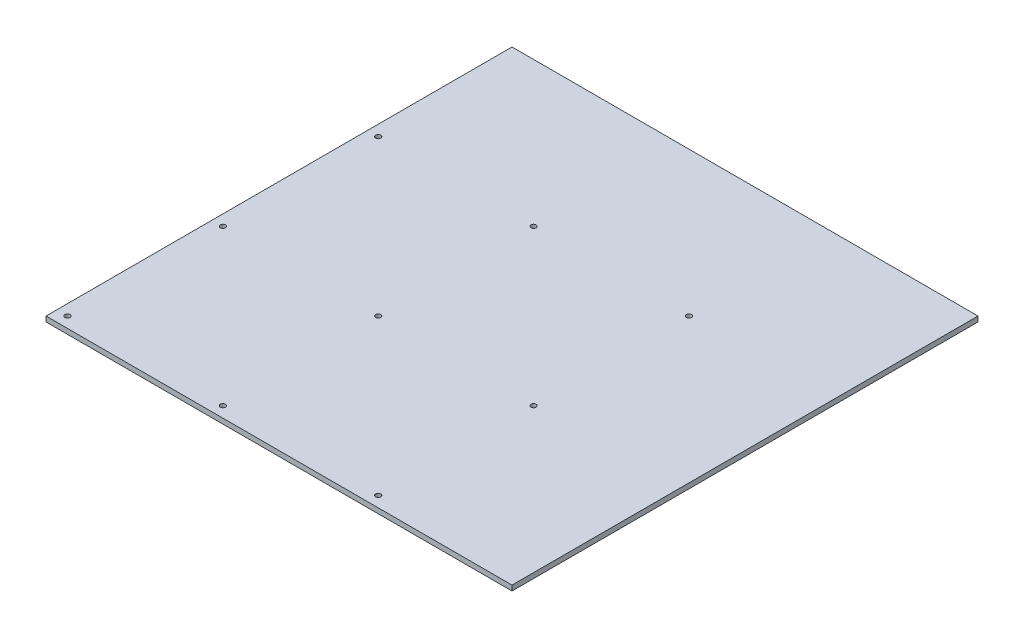
ISO-10303-21;
HEADER;
FILE_DESCRIPTION(('STEP AP214'),'2;1');
FILE_NAME('part.step','',(''),(''),'','','');
FILE_SCHEMA(('AUTOMOTIVE_DESIGN { 1 0 10303 214 1 1 1 1 }'));
ENDSEC;
DATA;
#1=APPLICATION_CONTEXT('core data for automotive mechanical design processes');
#2=APPLICATION_PROTOCOL_DEFINITION('international standard','automotive_design',2000,#1);
#3=PRODUCT_CONTEXT('',#1,'mechanical');
#4=PRODUCT('Part','Part','',(#3));
#5=PRODUCT_RELATED_PRODUCT_CATEGORY('part','',(#4));
#6=PRODUCT_DEFINITION_FORMATION('','',#4);
#7=PRODUCT_DEFINITION_CONTEXT('part definition',#1,'design');
#8=PRODUCT_DEFINITION('design','',#6,#7);
#9=PRODUCT_DEFINITION_SHAPE('','',#8);
#10=(LENGTH_UNIT() NAMED_UNIT(*) SI_UNIT(.MILLI.,.METRE.));
#11=(NAMED_UNIT(*) PLANE_ANGLE_UNIT() SI_UNIT($,.RADIAN.));
#12=(NAMED_UNIT(*) SI_UNIT($,.STERADIAN.) SOLID_ANGLE_UNIT());
#13=UNCERTAINTY_MEASURE_WITH_UNIT(LENGTH_MEASURE(1.E-05),#10,'distance_accuracy_value','');
#14=(GEOMETRIC_REPRESENTATION_CONTEXT(3) GLOBAL_UNCERTAINTY_ASSIGNED_CONTEXT((#13)) GLOBAL_UNIT_ASSIGNED_CONTEXT((#10,
#11,#12)) REPRESENTATION_CONTEXT('',''));
#15=CARTESIAN_POINT('',(0.,0.,0.));
#16=DIRECTION('',(0.,0.,1.));
#17=DIRECTION('',(1.,0.,0.));
#18=AXIS2_PLACEMENT_3D('',#15,#16,#17);
#19=CARTESIAN_POINT('',(0.,6.,0.));
#20=DIRECTION('',(0.,1.,0.));
#21=DIRECTION('',(0.,0.,1.));
#22=AXIS2_PLACEMENT_3D('',#19,#20,#21);
#23=PLANE('',#22);
#24=CARTESIAN_POINT('',(-257.500000000001,6.,77.5000000000001));
#25=DIRECTION('',(0.,1.,0.));
#26=DIRECTION('',(0.,0.,1.));
#27=AXIS2_PLACEMENT_3D('',#24,#25,#26);
#28=CIRCLE('',#27,2.99999999999999);
#29=CARTESIAN_POINT('',(-257.500000000001,6.,80.5000000000001));
#30=VERTEX_POINT('',#29);
#31=EDGE_CURVE('E152',#30,#30,#28,.T.);
#32=ORIENTED_EDGE('',*,*,#31,.F.);
#33=EDGE_LOOP('',(#32));
#34=FACE_BOUND('',#33,.T.);
#35=CARTESIAN_POINT('',(-77.5000000000012,6.,-102.5));
#36=DIRECTION('',(0.,1.,0.));
#37=DIRECTION('',(0.,0.,1.));
#38=AXIS2_PLACEMENT_3D('',#35,#36,#37);
#39=CIRCLE('',#38,3.00000000000001);
#40=CARTESIAN_POINT('',(-77.5000000000012,6.,-99.4999999999999));
#41=VERTEX_POINT('',#40);
#42=EDGE_CURVE('E140',#41,#41,#39,.T.);
#43=ORIENTED_EDGE('',*,*,#42,.F.);
#44=EDGE_LOOP('',(#43));
#45=FACE_BOUND('',#44,.T.);
#46=CARTESIAN_POINT('',(-77.5000000000006,6.,77.5000000000001));
#47=DIRECTION('',(0.,1.,0.));
#48=DIRECTION('',(0.,0.,1.));
#49=AXIS2_PLACEMENT_3D('',#46,#47,#48);
#50=CIRCLE('',#49,3.00000000000001);
#51=CARTESIAN_POINT('',(-77.5000000000006,6.,80.5000000000001));
#52=VERTEX_POINT('',#51);
#53=EDGE_CURVE('E128',#52,#52,#50,.T.);
#54=ORIENTED_EDGE('',*,*,#53,.F.);
#55=EDGE_LOOP('',(#54));
#56=FACE_BOUND('',#55,.T.);
#57=CARTESIAN_POINT('',(-77.5,6.,257.5));
#58=DIRECTION('',(0.,1.,0.));
#59=DIRECTION('',(0.,0.,1.));
#60=AXIS2_PLACEMENT_3D('',#57,#58,#59);
#61=CIRCLE('',#60,3.00000000000001);
#62=CARTESIAN_POINT('',(-77.5,6.,260.5));
#63=VERTEX_POINT('',#62);
#64=EDGE_CURVE('E116',#63,#63,#61,.T.);
#65=ORIENTED_EDGE('',*,*,#64,.F.);
#66=EDGE_LOOP('',(#65));
#67=FACE_BOUND('',#66,.T.);
#68=DIRECTION('',(0.,0.,1.));
#69=VECTOR('',#68,1.);
#70=CARTESIAN_POINT('',(-270.,6.,270.));
#71=LINE('',#70,#69);
#72=CARTESIAN_POINT('',(-270.,6.,-270.));
#73=VERTEX_POINT('',#72);
#74=CARTESIAN_POINT('',(-270.,6.,270.));
#75=VERTEX_POINT('',#74);
#76=EDGE_CURVE('E86',#73,#75,#71,.T.);
#77=ORIENTED_EDGE('',*,*,#76,.T.);
#78=DIRECTION('',(1.,0.,0.));
#79=VECTOR('',#78,1.);
#80=CARTESIAN_POINT('',(270.,6.,270.));
#81=LINE('',#80,#79);
#82=CARTESIAN_POINT('',(270.,6.,270.));
#83=VERTEX_POINT('',#82);
#84=EDGE_CURVE('E81',#75,#83,#81,.T.);
#85=ORIENTED_EDGE('',*,*,#84,.T.);
#86=DIRECTION('',(0.,0.,-1.));
#87=VECTOR('',#86,1.);
#88=CARTESIAN_POINT('',(270.,6.,270.));
#89=LINE('',#88,#87);
#90=CARTESIAN_POINT('',(270.,6.,-270.));
#91=VERTEX_POINT('',#90);
#92=EDGE_CURVE('E84',#83,#91,#89,.T.);
#93=ORIENTED_EDGE('',*,*,#92,.T.);
#94=DIRECTION('',(-1.,0.,0.));
#95=VECTOR('',#94,1.);
#96=CARTESIAN_POINT('',(270.,6.,-270.));
#97=LINE('',#96,#95);
#98=EDGE_CURVE('E51',#91,#73,#97,.T.);
#99=ORIENTED_EDGE('',*,*,#98,.T.);
#100=EDGE_LOOP('',(#77,#85,#93,#99));
#101=FACE_BOUND('',#100,.T.);
#102=CARTESIAN_POINT('',(-257.5,6.,257.5));
#103=DIRECTION('',(0.,1.,0.));
#104=DIRECTION('',(0.,0.,1.));
#105=AXIS2_PLACEMENT_3D('',#102,#103,#104);
#106=CIRCLE('',#105,2.99999999999999);
#107=CARTESIAN_POINT('',(-257.5,6.,260.5));
#108=VERTEX_POINT('',#107);
#109=EDGE_CURVE('E101',#108,#108,#106,.T.);
#110=ORIENTED_EDGE('',*,*,#109,.F.);
#111=EDGE_LOOP('',(#110));
#112=FACE_BOUND('',#111,.T.);
#113=CARTESIAN_POINT('',(102.5,6.,257.5));
#114=DIRECTION('',(0.,1.,0.));
#115=DIRECTION('',(0.,0.,1.));
#116=AXIS2_PLACEMENT_3D('',#113,#114,#115);
#117=CIRCLE('',#116,3.00000000000001);
#118=CARTESIAN_POINT('',(102.5,6.,260.5));
#119=VERTEX_POINT('',#118);
#120=EDGE_CURVE('E122',#119,#119,#117,.T.);
#121=ORIENTED_EDGE('',*,*,#120,.F.);
#122=EDGE_LOOP('',(#121));
#123=FACE_BOUND('',#122,.T.);
#124=CARTESIAN_POINT('',(102.499999999999,6.,77.5000000000001));
#125=DIRECTION('',(0.,1.,0.));
#126=DIRECTION('',(0.,0.,1.));
#127=AXIS2_PLACEMENT_3D('',#124,#125,#126);
#128=CIRCLE('',#127,3.00000000000001);
#129=CARTESIAN_POINT('',(102.499999999999,6.,80.5000000000001));
#130=VERTEX_POINT('',#129);
#131=EDGE_CURVE('E134',#130,#130,#128,.T.);
#132=ORIENTED_EDGE('',*,*,#131,.F.);
#133=EDGE_LOOP('',(#132));
#134=FACE_BOUND('',#133,.T.);
#135=CARTESIAN_POINT('',(102.499999999999,6.,-102.5));
#136=DIRECTION('',(0.,1.,0.));
#137=DIRECTION('',(0.,0.,1.));
#138=AXIS2_PLACEMENT_3D('',#135,#136,#137);
#139=CIRCLE('',#138,3.00000000000001);
#140=CARTESIAN_POINT('',(102.499999999999,6.,-99.4999999999999));
#141=VERTEX_POINT('',#140);
#142=EDGE_CURVE('E146',#141,#141,#139,.T.);
#143=ORIENTED_EDGE('',*,*,#142,.F.);
#144=EDGE_LOOP('',(#143));
#145=FACE_BOUND('',#144,.T.);
#146=CARTESIAN_POINT('',(-257.500000000001,6.,-102.5));
#147=DIRECTION('',(0.,1.,0.));
#148=DIRECTION('',(0.,0.,1.));
#149=AXIS2_PLACEMENT_3D('',#146,#147,#148);
#150=CIRCLE('',#149,2.99999999999999);
#151=CARTESIAN_POINT('',(-257.500000000001,6.,-99.4999999999999));
#152=VERTEX_POINT('',#151);
#153=EDGE_CURVE('E158',#152,#152,#150,.T.);
#154=ORIENTED_EDGE('',*,*,#153,.F.);
#155=EDGE_LOOP('',(#154));
#156=FACE_BOUND('',#155,.T.);
#157=ADVANCED_FACE('F34',(#34,#45,#56,#67,#101,#112,#123,#134,#145,#156),#23,.T.);
#158=CARTESIAN_POINT('',(0.,0.,0.));
#159=DIRECTION('',(0.,1.,0.));
#160=DIRECTION('',(0.,0.,1.));
#161=AXIS2_PLACEMENT_3D('',#158,#159,#160);
#162=PLANE('',#161);
#163=DIRECTION('',(0.,0.,1.));
#164=VECTOR('',#163,1.);
#165=CARTESIAN_POINT('',(-270.,0.,270.));
#166=LINE('',#165,#164);
#167=CARTESIAN_POINT('',(-270.,0.,-270.));
#168=VERTEX_POINT('',#167);
#169=CARTESIAN_POINT('',(-270.,0.,270.));
#170=VERTEX_POINT('',#169);
#171=EDGE_CURVE('E98',#168,#170,#166,.T.);
#172=ORIENTED_EDGE('',*,*,#171,.F.);
#173=DIRECTION('',(-1.,0.,0.));
#174=VECTOR('',#173,1.);
#175=CARTESIAN_POINT('',(270.,0.,-270.));
#176=LINE('',#175,#174);
#177=CARTESIAN_POINT('',(270.,0.,-270.));
#178=VERTEX_POINT('',#177);
#179=EDGE_CURVE('E74',#178,#168,#176,.T.);
#180=ORIENTED_EDGE('',*,*,#179,.F.);
#181=DIRECTION('',(0.,0.,-1.));
#182=VECTOR('',#181,1.);
#183=CARTESIAN_POINT('',(270.,0.,270.));
#184=LINE('',#183,#182);
#185=CARTESIAN_POINT('',(270.,0.,270.));
#186=VERTEX_POINT('',#185);
#187=EDGE_CURVE('E68',#186,#178,#184,.T.);
#188=ORIENTED_EDGE('',*,*,#187,.F.);
#189=DIRECTION('',(1.,0.,0.));
#190=VECTOR('',#189,1.);
#191=CARTESIAN_POINT('',(270.,0.,270.));
#192=LINE('',#191,#190);
#193=EDGE_CURVE('E90',#170,#186,#192,.T.);
#194=ORIENTED_EDGE('',*,*,#193,.F.);
#195=EDGE_LOOP('',(#172,#180,#188,#194));
#196=FACE_BOUND('',#195,.T.);
#197=CARTESIAN_POINT('',(-257.5,0.,257.5));
#198=DIRECTION('',(0.,1.,0.));
#199=DIRECTION('',(0.,0.,1.));
#200=AXIS2_PLACEMENT_3D('',#197,#198,#199);
#201=CIRCLE('',#200,2.99999999999999);
#202=CARTESIAN_POINT('',(-257.5,0.,260.5));
#203=VERTEX_POINT('',#202);
#204=EDGE_CURVE('E113',#203,#203,#201,.T.);
#205=ORIENTED_EDGE('',*,*,#204,.T.);
#206=EDGE_LOOP('',(#205));
#207=FACE_BOUND('',#206,.T.);
#208=CARTESIAN_POINT('',(-77.5,0.,257.5));
#209=DIRECTION('',(0.,1.,0.));
#210=DIRECTION('',(0.,0.,1.));
#211=AXIS2_PLACEMENT_3D('',#208,#209,#210);
#212=CIRCLE('',#211,3.00000000000001);
#213=CARTESIAN_POINT('',(-77.5,0.,260.5));
#214=VERTEX_POINT('',#213);
#215=EDGE_CURVE('E119',#214,#214,#212,.T.);
#216=ORIENTED_EDGE('',*,*,#215,.T.);
#217=EDGE_LOOP('',(#216));
#218=FACE_BOUND('',#217,.T.);
#219=CARTESIAN_POINT('',(102.5,0.,257.5));
#220=DIRECTION('',(0.,1.,0.));
#221=DIRECTION('',(0.,0.,1.));
#222=AXIS2_PLACEMENT_3D('',#219,#220,#221);
#223=CIRCLE('',#222,3.00000000000001);
#224=CARTESIAN_POINT('',(102.5,0.,260.5));
#225=VERTEX_POINT('',#224);
#226=EDGE_CURVE('E125',#225,#225,#223,.T.);
#227=ORIENTED_EDGE('',*,*,#226,.T.);
#228=EDGE_LOOP('',(#227));
#229=FACE_BOUND('',#228,.T.);
#230=CARTESIAN_POINT('',(-77.5000000000006,0.,77.5000000000001));
#231=DIRECTION('',(0.,1.,0.));
#232=DIRECTION('',(0.,0.,1.));
#233=AXIS2_PLACEMENT_3D('',#230,#231,#232);
#234=CIRCLE('',#233,3.00000000000001);
#235=CARTESIAN_POINT('',(-77.5000000000006,0.,80.5000000000001));
#236=VERTEX_POINT('',#235);
#237=EDGE_CURVE('E131',#236,#236,#234,.T.);
#238=ORIENTED_EDGE('',*,*,#237,.T.);
#239=EDGE_LOOP('',(#238));
#240=FACE_BOUND('',#239,.T.);
#241=CARTESIAN_POINT('',(102.499999999999,0.,77.5000000000001));
#242=DIRECTION('',(0.,1.,0.));
#243=DIRECTION('',(0.,0.,1.));
#244=AXIS2_PLACEMENT_3D('',#241,#242,#243);
#245=CIRCLE('',#244,3.00000000000001);
#246=CARTESIAN_POINT('',(102.499999999999,0.,80.5000000000001));
#247=VERTEX_POINT('',#246);
#248=EDGE_CURVE('E137',#247,#247,#245,.T.);
#249=ORIENTED_EDGE('',*,*,#248,.T.);
#250=EDGE_LOOP('',(#249));
#251=FACE_BOUND('',#250,.T.);
#252=CARTESIAN_POINT('',(-77.5000000000012,0.,-102.5));
#253=DIRECTION('',(0.,1.,0.));
#254=DIRECTION('',(0.,0.,1.));
#255=AXIS2_PLACEMENT_3D('',#252,#253,#254);
#256=CIRCLE('',#255,3.00000000000001);
#257=CARTESIAN_POINT('',(-77.5000000000012,0.,-99.4999999999999));
#258=VERTEX_POINT('',#257);
#259=EDGE_CURVE('E143',#258,#258,#256,.T.);
#260=ORIENTED_EDGE('',*,*,#259,.T.);
#261=EDGE_LOOP('',(#260));
#262=FACE_BOUND('',#261,.T.);
#263=CARTESIAN_POINT('',(102.499999999999,0.,-102.5));
#264=DIRECTION('',(0.,1.,0.));
#265=DIRECTION('',(0.,0.,1.));
#266=AXIS2_PLACEMENT_3D('',#263,#264,#265);
#267=CIRCLE('',#266,3.00000000000001);
#268=CARTESIAN_POINT('',(102.499999999999,0.,-99.4999999999999));
#269=VERTEX_POINT('',#268);
#270=EDGE_CURVE('E149',#269,#269,#267,.T.);
#271=ORIENTED_EDGE('',*,*,#270,.T.);
#272=EDGE_LOOP('',(#271));
#273=FACE_BOUND('',#272,.T.);
#274=CARTESIAN_POINT('',(-257.500000000001,0.,77.5000000000001));
#275=DIRECTION('',(0.,1.,0.));
#276=DIRECTION('',(0.,0.,1.));
#277=AXIS2_PLACEMENT_3D('',#274,#275,#276);
#278=CIRCLE('',#277,2.99999999999999);
#279=CARTESIAN_POINT('',(-257.500000000001,0.,80.5000000000001));
#280=VERTEX_POINT('',#279);
#281=EDGE_CURVE('E155',#280,#280,#278,.T.);
#282=ORIENTED_EDGE('',*,*,#281,.T.);
#283=EDGE_LOOP('',(#282));
#284=FACE_BOUND('',#283,.T.);
#285=CARTESIAN_POINT('',(-257.500000000001,0.,-102.5));
#286=DIRECTION('',(0.,1.,0.));
#287=DIRECTION('',(0.,0.,1.));
#288=AXIS2_PLACEMENT_3D('',#285,#286,#287);
#289=CIRCLE('',#288,2.99999999999999);
#290=CARTESIAN_POINT('',(-257.500000000001,0.,-99.4999999999999));
#291=VERTEX_POINT('',#290);
#292=EDGE_CURVE('E161',#291,#291,#289,.T.);
#293=ORIENTED_EDGE('',*,*,#292,.T.);
#294=EDGE_LOOP('',(#293));
#295=FACE_BOUND('',#294,.T.);
#296=ADVANCED_FACE('F109',(#196,#207,#218,#229,#240,#251,#262,#273,#284,#295),#162,.F.);
#297=CARTESIAN_POINT('',(-270.,6.,270.));
#298=DIRECTION('',(1.,0.,0.));
#299=DIRECTION('',(0.,0.,-1.));
#300=AXIS2_PLACEMENT_3D('',#297,#298,#299);
#301=PLANE('',#300);
#302=ORIENTED_EDGE('',*,*,#171,.T.);
#303=DIRECTION('',(0.,-1.,0.));
#304=VECTOR('',#303,1.);
#305=CARTESIAN_POINT('',(-270.,6.,270.));
#306=LINE('',#305,#304);
#307=EDGE_CURVE('E11',#75,#170,#306,.T.);
#308=ORIENTED_EDGE('',*,*,#307,.F.);
#309=ORIENTED_EDGE('',*,*,#76,.F.);
#310=DIRECTION('',(0.,-1.,0.));
#311=VECTOR('',#310,1.);
#312=CARTESIAN_POINT('',(-270.,6.,-270.));
#313=LINE('',#312,#311);
#314=EDGE_CURVE('E94',#73,#168,#313,.T.);
#315=ORIENTED_EDGE('',*,*,#314,.T.);
#316=EDGE_LOOP('',(#302,#308,#309,#315));
#317=FACE_BOUND('',#316,.T.);
#318=ADVANCED_FACE('F36',(#317),#301,.F.);
#319=CARTESIAN_POINT('',(270.,6.,270.));
#320=DIRECTION('',(0.,0.,-1.));
#321=DIRECTION('',(-1.,0.,0.));
#322=AXIS2_PLACEMENT_3D('',#319,#320,#321);
#323=PLANE('',#322);
#324=ORIENTED_EDGE('',*,*,#193,.T.);
#325=DIRECTION('',(0.,-1.,0.));
#326=VECTOR('',#325,1.);
#327=CARTESIAN_POINT('',(270.,6.,270.));
#328=LINE('',#327,#326);
#329=EDGE_CURVE('E43',#83,#186,#328,.T.);
#330=ORIENTED_EDGE('',*,*,#329,.F.);
#331=ORIENTED_EDGE('',*,*,#84,.F.);
#332=ORIENTED_EDGE('',*,*,#307,.T.);
#333=EDGE_LOOP('',(#324,#330,#331,#332));
#334=FACE_BOUND('',#333,.T.);
#335=ADVANCED_FACE('F89',(#334),#323,.F.);
#336=CARTESIAN_POINT('',(270.,6.,270.));
#337=DIRECTION('',(-1.,0.,0.));
#338=DIRECTION('',(0.,0.,1.));
#339=AXIS2_PLACEMENT_3D('',#336,#337,#338);
#340=PLANE('',#339);
#341=ORIENTED_EDGE('',*,*,#187,.T.);
#342=DIRECTION('',(0.,-1.,0.));
#343=VECTOR('',#342,1.);
#344=CARTESIAN_POINT('',(270.,6.,-270.));
#345=LINE('',#344,#343);
#346=EDGE_CURVE('E91',#91,#178,#345,.T.);
#347=ORIENTED_EDGE('',*,*,#346,.F.);
#348=ORIENTED_EDGE('',*,*,#92,.F.);
#349=ORIENTED_EDGE('',*,*,#329,.T.);
#350=EDGE_LOOP('',(#341,#347,#348,#349));
#351=FACE_BOUND('',#350,.T.);
#352=ADVANCED_FACE('F92',(#351),#340,.F.);
#353=CARTESIAN_POINT('',(270.,6.,-270.));
#354=DIRECTION('',(0.,0.,1.));
#355=DIRECTION('',(1.,0.,0.));
#356=AXIS2_PLACEMENT_3D('',#353,#354,#355);
#357=PLANE('',#356);
#358=ORIENTED_EDGE('',*,*,#179,.T.);
#359=ORIENTED_EDGE('',*,*,#314,.F.);
#360=ORIENTED_EDGE('',*,*,#98,.F.);
#361=ORIENTED_EDGE('',*,*,#346,.T.);
#362=EDGE_LOOP('',(#358,#359,#360,#361));
#363=FACE_BOUND('',#362,.T.);
#364=ADVANCED_FACE('F106',(#363),#357,.F.);
#365=CARTESIAN_POINT('',(-257.5,6.,257.5));
#366=DIRECTION('',(0.,-1.,0.));
#367=DIRECTION('',(0.,0.,-1.));
#368=AXIS2_PLACEMENT_3D('',#365,#366,#367);
#369=CYLINDRICAL_SURFACE('',#368,2.99999999999999);
#370=ORIENTED_EDGE('',*,*,#109,.T.);
#371=EDGE_LOOP('',(#370));
#372=FACE_BOUND('',#371,.T.);
#373=ORIENTED_EDGE('',*,*,#204,.F.);
#374=EDGE_LOOP('',(#373));
#375=FACE_BOUND('',#374,.T.);
#376=ADVANCED_FACE('F180',(#372,#375),#369,.F.);
#377=CARTESIAN_POINT('',(-77.5,6.,257.5));
#378=DIRECTION('',(0.,-1.,0.));
#379=DIRECTION('',(0.,0.,-1.));
#380=AXIS2_PLACEMENT_3D('',#377,#378,#379);
#381=CYLINDRICAL_SURFACE('',#380,3.00000000000001);
#382=ORIENTED_EDGE('',*,*,#64,.T.);
#383=EDGE_LOOP('',(#382));
#384=FACE_BOUND('',#383,.T.);
#385=ORIENTED_EDGE('',*,*,#215,.F.);
#386=EDGE_LOOP('',(#385));
#387=FACE_BOUND('',#386,.T.);
#388=ADVANCED_FACE('F226',(#384,#387),#381,.F.);
#389=CARTESIAN_POINT('',(102.5,6.,257.5));
#390=DIRECTION('',(0.,-1.,0.));
#391=DIRECTION('',(0.,0.,-1.));
#392=AXIS2_PLACEMENT_3D('',#389,#390,#391);
#393=CYLINDRICAL_SURFACE('',#392,3.00000000000001);
#394=ORIENTED_EDGE('',*,*,#120,.T.);
#395=EDGE_LOOP('',(#394));
#396=FACE_BOUND('',#395,.T.);
#397=ORIENTED_EDGE('',*,*,#226,.F.);
#398=EDGE_LOOP('',(#397));
#399=FACE_BOUND('',#398,.T.);
#400=ADVANCED_FACE('F234',(#396,#399),#393,.F.);
#401=CARTESIAN_POINT('',(-77.5000000000006,6.,77.5000000000001));
#402=DIRECTION('',(0.,-1.,0.));
#403=DIRECTION('',(0.,0.,-1.));
#404=AXIS2_PLACEMENT_3D('',#401,#402,#403);
#405=CYLINDRICAL_SURFACE('',#404,3.00000000000001);
#406=ORIENTED_EDGE('',*,*,#53,.T.);
#407=EDGE_LOOP('',(#406));
#408=FACE_BOUND('',#407,.T.);
#409=ORIENTED_EDGE('',*,*,#237,.F.);
#410=EDGE_LOOP('',(#409));
#411=FACE_BOUND('',#410,.T.);
#412=ADVANCED_FACE('F242',(#408,#411),#405,.F.);
#413=CARTESIAN_POINT('',(102.499999999999,6.,77.5000000000001));
#414=DIRECTION('',(0.,-1.,0.));
#415=DIRECTION('',(0.,0.,-1.));
#416=AXIS2_PLACEMENT_3D('',#413,#414,#415);
#417=CYLINDRICAL_SURFACE('',#416,3.00000000000001);
#418=ORIENTED_EDGE('',*,*,#131,.T.);
#419=EDGE_LOOP('',(#418));
#420=FACE_BOUND('',#419,.T.);
#421=ORIENTED_EDGE('',*,*,#248,.F.);
#422=EDGE_LOOP('',(#421));
#423=FACE_BOUND('',#422,.T.);
#424=ADVANCED_FACE('F251',(#420,#423),#417,.F.);
#425=CARTESIAN_POINT('',(-77.5000000000012,6.,-102.5));
#426=DIRECTION('',(0.,-1.,0.));
#427=DIRECTION('',(0.,0.,-1.));
#428=AXIS2_PLACEMENT_3D('',#425,#426,#427);
#429=CYLINDRICAL_SURFACE('',#428,3.00000000000001);
#430=ORIENTED_EDGE('',*,*,#42,.T.);
#431=EDGE_LOOP('',(#430));
#432=FACE_BOUND('',#431,.T.);
#433=ORIENTED_EDGE('',*,*,#259,.F.);
#434=EDGE_LOOP('',(#433));
#435=FACE_BOUND('',#434,.T.);
#436=ADVANCED_FACE('F260',(#432,#435),#429,.F.);
#437=CARTESIAN_POINT('',(102.499999999999,6.,-102.5));
#438=DIRECTION('',(0.,-1.,0.));
#439=DIRECTION('',(0.,0.,-1.));
#440=AXIS2_PLACEMENT_3D('',#437,#438,#439);
#441=CYLINDRICAL_SURFACE('',#440,3.00000000000001);
#442=ORIENTED_EDGE('',*,*,#142,.T.);
#443=EDGE_LOOP('',(#442));
#444=FACE_BOUND('',#443,.T.);
#445=ORIENTED_EDGE('',*,*,#270,.F.);
#446=EDGE_LOOP('',(#445));
#447=FACE_BOUND('',#446,.T.);
#448=ADVANCED_FACE('F269',(#444,#447),#441,.F.);
#449=CARTESIAN_POINT('',(-257.500000000001,6.,77.5000000000001));
#450=DIRECTION('',(0.,-1.,0.));
#451=DIRECTION('',(0.,0.,-1.));
#452=AXIS2_PLACEMENT_3D('',#449,#450,#451);
#453=CYLINDRICAL_SURFACE('',#452,2.99999999999999);
#454=ORIENTED_EDGE('',*,*,#31,.T.);
#455=EDGE_LOOP('',(#454));
#456=FACE_BOUND('',#455,.T.);
#457=ORIENTED_EDGE('',*,*,#281,.F.);
#458=EDGE_LOOP('',(#457));
#459=FACE_BOUND('',#458,.T.);
#460=ADVANCED_FACE('F278',(#456,#459),#453,.F.);
#461=CARTESIAN_POINT('',(-257.500000000001,6.,-102.5));
#462=DIRECTION('',(0.,-1.,0.));
#463=DIRECTION('',(0.,0.,-1.));
#464=AXIS2_PLACEMENT_3D('',#461,#462,#463);
#465=CYLINDRICAL_SURFACE('',#464,2.99999999999999);
#466=ORIENTED_EDGE('',*,*,#153,.T.);
#467=EDGE_LOOP('',(#466));
#468=FACE_BOUND('',#467,.T.);
#469=ORIENTED_EDGE('',*,*,#292,.F.);
#470=EDGE_LOOP('',(#469));
#471=FACE_BOUND('',#470,.T.);
#472=ADVANCED_FACE('F167',(#468,#471),#465,.F.);
#473=CLOSED_SHELL('',(#157,#296,#318,#335,#352,#364,#376,#388,#400,#412,#424,#436,#448,#460,#472));
#474=MANIFOLD_SOLID_BREP('B2',#473);
#475=ADVANCED_BREP_SHAPE_REPRESENTATION('',(#18,#474),#14);
#476=SHAPE_DEFINITION_REPRESENTATION(#9,#475);
ENDSEC;
END-ISO-10303-21;
